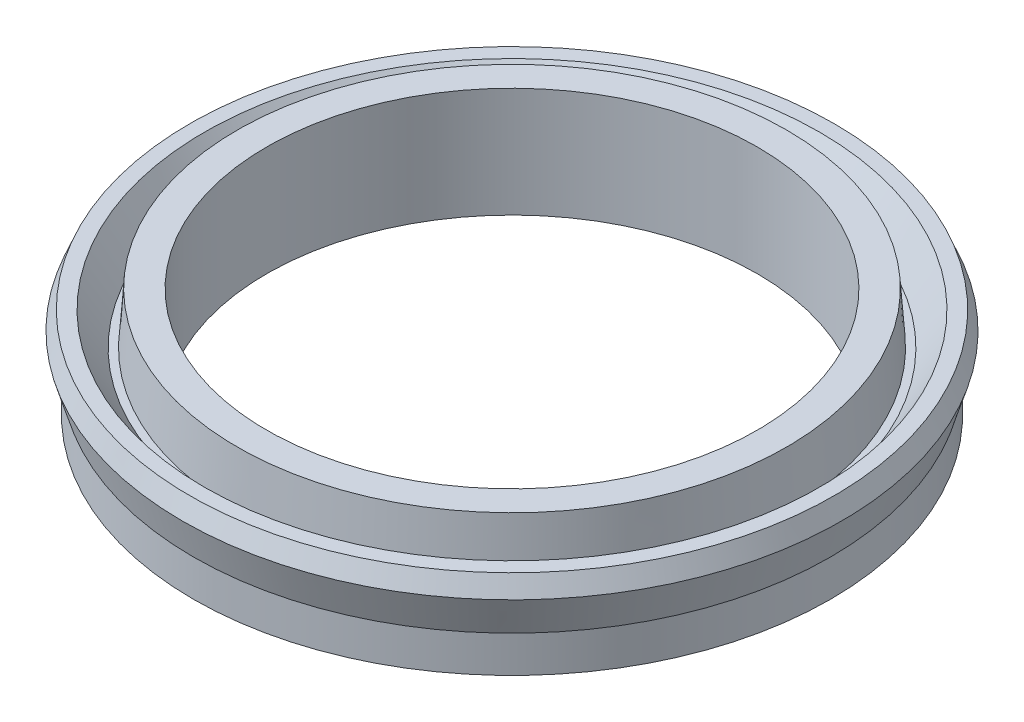
ISO-10303-21;
HEADER;
FILE_DESCRIPTION(('STEP AP214'),'2;1');
FILE_NAME('part.step','',(''),(''),'','','');
FILE_SCHEMA(('AUTOMOTIVE_DESIGN { 1 0 10303 214 1 1 1 1 }'));
ENDSEC;
DATA;
#1=APPLICATION_CONTEXT('core data for automotive mechanical design processes');
#2=APPLICATION_PROTOCOL_DEFINITION('international standard','automotive_design',2000,#1);
#3=PRODUCT_CONTEXT('',#1,'mechanical');
#4=PRODUCT('Part','Part','',(#3));
#5=PRODUCT_RELATED_PRODUCT_CATEGORY('part','',(#4));
#6=PRODUCT_DEFINITION_FORMATION('','',#4);
#7=PRODUCT_DEFINITION_CONTEXT('part definition',#1,'design');
#8=PRODUCT_DEFINITION('design','',#6,#7);
#9=PRODUCT_DEFINITION_SHAPE('','',#8);
#10=(LENGTH_UNIT() NAMED_UNIT(*) SI_UNIT(.MILLI.,.METRE.));
#11=(NAMED_UNIT(*) PLANE_ANGLE_UNIT() SI_UNIT($,.RADIAN.));
#12=(NAMED_UNIT(*) SI_UNIT($,.STERADIAN.) SOLID_ANGLE_UNIT());
#13=UNCERTAINTY_MEASURE_WITH_UNIT(LENGTH_MEASURE(1.E-05),#10,'distance_accuracy_value','');
#14=(GEOMETRIC_REPRESENTATION_CONTEXT(3) GLOBAL_UNCERTAINTY_ASSIGNED_CONTEXT((#13)) GLOBAL_UNIT_ASSIGNED_CONTEXT((#10,
#11,#12)) REPRESENTATION_CONTEXT('',''));
#15=CARTESIAN_POINT('',(0.,0.,0.));
#16=DIRECTION('',(0.,0.,1.));
#17=DIRECTION('',(1.,0.,0.));
#18=AXIS2_PLACEMENT_3D('',#15,#16,#17);
#19=CARTESIAN_POINT('',(8.7,0.,0.));
#20=DIRECTION('',(0.,-1.,0.));
#21=DIRECTION('',(0.,0.,-1.));
#22=AXIS2_PLACEMENT_3D('',#19,#20,#21);
#23=PLANE('',#22);
#24=CARTESIAN_POINT('',(0.,0.,0.));
#25=DIRECTION('',(0.,-1.,0.));
#26=DIRECTION('',(0.,0.,-1.));
#27=AXIS2_PLACEMENT_3D('',#24,#25,#26);
#28=CIRCLE('',#27,8.7);
#29=CARTESIAN_POINT('',(0.,0.,-8.7));
#30=VERTEX_POINT('',#29);
#31=EDGE_CURVE('E49',#30,#30,#28,.T.);
#32=ORIENTED_EDGE('',*,*,#31,.T.);
#33=EDGE_LOOP('',(#32));
#34=FACE_BOUND('',#33,.T.);
#35=CARTESIAN_POINT('',(0.,0.,0.));
#36=DIRECTION('',(0.,-1.,0.));
#37=DIRECTION('',(0.,0.,-1.));
#38=AXIS2_PLACEMENT_3D('',#35,#36,#37);
#39=CIRCLE('',#38,6.7);
#40=CARTESIAN_POINT('',(0.,0.,-6.7));
#41=VERTEX_POINT('',#40);
#42=EDGE_CURVE('E10',#41,#41,#39,.T.);
#43=ORIENTED_EDGE('',*,*,#42,.F.);
#44=EDGE_LOOP('',(#43));
#45=FACE_BOUND('',#44,.T.);
#46=ADVANCED_FACE('F15',(#34,#45),#23,.T.);
#47=CARTESIAN_POINT('',(0.,0.,0.));
#48=DIRECTION('',(0.,-1.,0.));
#49=DIRECTION('',(0.,0.,-1.));
#50=AXIS2_PLACEMENT_3D('',#47,#48,#49);
#51=CYLINDRICAL_SURFACE('',#50,6.7);
#52=ORIENTED_EDGE('',*,*,#42,.T.);
#53=EDGE_LOOP('',(#52));
#54=FACE_BOUND('',#53,.T.);
#55=CARTESIAN_POINT('',(0.,3.,0.));
#56=DIRECTION('',(0.,-1.,0.));
#57=DIRECTION('',(0.,0.,-1.));
#58=AXIS2_PLACEMENT_3D('',#55,#56,#57);
#59=CIRCLE('',#58,6.7);
#60=CARTESIAN_POINT('',(0.,3.,-6.7));
#61=VERTEX_POINT('',#60);
#62=EDGE_CURVE('E21',#61,#61,#59,.T.);
#63=ORIENTED_EDGE('',*,*,#62,.F.);
#64=EDGE_LOOP('',(#63));
#65=FACE_BOUND('',#64,.T.);
#66=ADVANCED_FACE('F69',(#54,#65),#51,.F.);
#67=CARTESIAN_POINT('',(6.7,3.,0.));
#68=DIRECTION('',(0.,1.,0.));
#69=DIRECTION('',(0.,0.,1.));
#70=AXIS2_PLACEMENT_3D('',#67,#68,#69);
#71=PLANE('',#70);
#72=ORIENTED_EDGE('',*,*,#62,.T.);
#73=EDGE_LOOP('',(#72));
#74=FACE_BOUND('',#73,.T.);
#75=CARTESIAN_POINT('',(0.,3.,0.));
#76=DIRECTION('',(0.,-1.,0.));
#77=DIRECTION('',(0.,0.,-1.));
#78=AXIS2_PLACEMENT_3D('',#75,#76,#77);
#79=CIRCLE('',#78,7.5);
#80=CARTESIAN_POINT('',(0.,3.,-7.5));
#81=VERTEX_POINT('',#80);
#82=EDGE_CURVE('E25',#81,#81,#79,.T.);
#83=ORIENTED_EDGE('',*,*,#82,.F.);
#84=EDGE_LOOP('',(#83));
#85=FACE_BOUND('',#84,.T.);
#86=ADVANCED_FACE('F74',(#74,#85),#71,.T.);
#87=CARTESIAN_POINT('',(0.,1.6,0.));
#88=DIRECTION('',(0.,-1.,0.));
#89=DIRECTION('',(0.,0.,-1.));
#90=AXIS2_PLACEMENT_3D('',#87,#88,#89);
#91=CONICAL_SURFACE('',#90,7.6,0.0713074647852905);
#92=ORIENTED_EDGE('',*,*,#82,.T.);
#93=EDGE_LOOP('',(#92));
#94=FACE_BOUND('',#93,.T.);
#95=CARTESIAN_POINT('',(0.,1.6,0.));
#96=DIRECTION('',(0.,-1.,0.));
#97=DIRECTION('',(0.,0.,-1.));
#98=AXIS2_PLACEMENT_3D('',#95,#96,#97);
#99=CIRCLE('',#98,7.6);
#100=CARTESIAN_POINT('',(0.,1.6,-7.6));
#101=VERTEX_POINT('',#100);
#102=EDGE_CURVE('E29',#101,#101,#99,.T.);
#103=ORIENTED_EDGE('',*,*,#102,.F.);
#104=EDGE_LOOP('',(#103));
#105=FACE_BOUND('',#104,.T.);
#106=ADVANCED_FACE('F79',(#94,#105),#91,.T.);
#107=CARTESIAN_POINT('',(7.6,1.6,0.));
#108=DIRECTION('',(0.,1.,0.));
#109=DIRECTION('',(0.,0.,1.));
#110=AXIS2_PLACEMENT_3D('',#107,#108,#109);
#111=PLANE('',#110);
#112=ORIENTED_EDGE('',*,*,#102,.T.);
#113=EDGE_LOOP('',(#112));
#114=FACE_BOUND('',#113,.T.);
#115=CARTESIAN_POINT('',(0.,1.6,0.));
#116=DIRECTION('',(0.,-1.,0.));
#117=DIRECTION('',(0.,0.,-1.));
#118=AXIS2_PLACEMENT_3D('',#115,#116,#117);
#119=CIRCLE('',#118,7.8);
#120=CARTESIAN_POINT('',(0.,1.6,-7.8));
#121=VERTEX_POINT('',#120);
#122=EDGE_CURVE('E34',#121,#121,#119,.T.);
#123=ORIENTED_EDGE('',*,*,#122,.F.);
#124=EDGE_LOOP('',(#123));
#125=FACE_BOUND('',#124,.T.);
#126=ADVANCED_FACE('F85',(#114,#125),#111,.T.);
#127=CARTESIAN_POINT('',(0.,2.5,0.));
#128=DIRECTION('',(0.,1.,0.));
#129=DIRECTION('',(0.,0.,1.));
#130=AXIS2_PLACEMENT_3D('',#127,#128,#129);
#131=CONICAL_SURFACE('',#130,8.4,0.588002603547568);
#132=ORIENTED_EDGE('',*,*,#122,.T.);
#133=EDGE_LOOP('',(#132));
#134=FACE_BOUND('',#133,.T.);
#135=CARTESIAN_POINT('',(0.,2.5,0.));
#136=DIRECTION('',(0.,-1.,0.));
#137=DIRECTION('',(0.,0.,-1.));
#138=AXIS2_PLACEMENT_3D('',#135,#136,#137);
#139=CIRCLE('',#138,8.4);
#140=CARTESIAN_POINT('',(0.,2.5,-8.4));
#141=VERTEX_POINT('',#140);
#142=EDGE_CURVE('E37',#141,#141,#139,.T.);
#143=ORIENTED_EDGE('',*,*,#142,.F.);
#144=EDGE_LOOP('',(#143));
#145=FACE_BOUND('',#144,.T.);
#146=ADVANCED_FACE('F89',(#134,#145),#131,.F.);
#147=CARTESIAN_POINT('',(8.4,2.5,0.));
#148=DIRECTION('',(0.,1.,0.));
#149=DIRECTION('',(0.,0.,1.));
#150=AXIS2_PLACEMENT_3D('',#147,#148,#149);
#151=PLANE('',#150);
#152=ORIENTED_EDGE('',*,*,#142,.T.);
#153=EDGE_LOOP('',(#152));
#154=FACE_BOUND('',#153,.T.);
#155=CARTESIAN_POINT('',(0.,2.5,0.));
#156=DIRECTION('',(0.,-1.,0.));
#157=DIRECTION('',(0.,0.,-1.));
#158=AXIS2_PLACEMENT_3D('',#155,#156,#157);
#159=CIRCLE('',#158,8.8);
#160=CARTESIAN_POINT('',(0.,2.5,-8.8));
#161=VERTEX_POINT('',#160);
#162=EDGE_CURVE('E40',#161,#161,#159,.T.);
#163=ORIENTED_EDGE('',*,*,#162,.F.);
#164=EDGE_LOOP('',(#163));
#165=FACE_BOUND('',#164,.T.);
#166=ADVANCED_FACE('F93',(#154,#165),#151,.T.);
#167=CARTESIAN_POINT('',(0.,2.,0.));
#168=DIRECTION('',(0.,-1.,0.));
#169=DIRECTION('',(0.,0.,-1.));
#170=AXIS2_PLACEMENT_3D('',#167,#168,#169);
#171=CONICAL_SURFACE('',#170,9.,0.380506377112366);
#172=ORIENTED_EDGE('',*,*,#162,.T.);
#173=EDGE_LOOP('',(#172));
#174=FACE_BOUND('',#173,.T.);
#175=CARTESIAN_POINT('',(0.,2.,0.));
#176=DIRECTION('',(0.,-1.,0.));
#177=DIRECTION('',(0.,0.,-1.));
#178=AXIS2_PLACEMENT_3D('',#175,#176,#177);
#179=CIRCLE('',#178,9.);
#180=CARTESIAN_POINT('',(0.,2.,-9.));
#181=VERTEX_POINT('',#180);
#182=EDGE_CURVE('E43',#181,#181,#179,.T.);
#183=ORIENTED_EDGE('',*,*,#182,.F.);
#184=EDGE_LOOP('',(#183));
#185=FACE_BOUND('',#184,.T.);
#186=ADVANCED_FACE('F65',(#174,#185),#171,.T.);
#187=CARTESIAN_POINT('',(0.,1.,0.));
#188=DIRECTION('',(0.,1.,0.));
#189=DIRECTION('',(0.,0.,1.));
#190=AXIS2_PLACEMENT_3D('',#187,#188,#189);
#191=CONICAL_SURFACE('',#190,8.7,0.291456794477867);
#192=ORIENTED_EDGE('',*,*,#182,.T.);
#193=EDGE_LOOP('',(#192));
#194=FACE_BOUND('',#193,.T.);
#195=CARTESIAN_POINT('',(0.,1.,0.));
#196=DIRECTION('',(0.,-1.,0.));
#197=DIRECTION('',(0.,0.,-1.));
#198=AXIS2_PLACEMENT_3D('',#195,#196,#197);
#199=CIRCLE('',#198,8.7);
#200=CARTESIAN_POINT('',(0.,1.,-8.7));
#201=VERTEX_POINT('',#200);
#202=EDGE_CURVE('E46',#201,#201,#199,.T.);
#203=ORIENTED_EDGE('',*,*,#202,.F.);
#204=EDGE_LOOP('',(#203));
#205=FACE_BOUND('',#204,.T.);
#206=ADVANCED_FACE('F57',(#194,#205),#191,.T.);
#207=CARTESIAN_POINT('',(0.,0.,0.));
#208=DIRECTION('',(0.,-1.,0.));
#209=DIRECTION('',(0.,0.,-1.));
#210=AXIS2_PLACEMENT_3D('',#207,#208,#209);
#211=CYLINDRICAL_SURFACE('',#210,8.7);
#212=ORIENTED_EDGE('',*,*,#202,.T.);
#213=EDGE_LOOP('',(#212));
#214=FACE_BOUND('',#213,.T.);
#215=ORIENTED_EDGE('',*,*,#31,.F.);
#216=EDGE_LOOP('',(#215));
#217=FACE_BOUND('',#216,.T.);
#218=ADVANCED_FACE('F55',(#214,#217),#211,.T.);
#219=CLOSED_SHELL('',(#46,#66,#86,#106,#126,#146,#166,#186,#206,#218));
#220=MANIFOLD_SOLID_BREP('B1',#219);
#221=ADVANCED_BREP_SHAPE_REPRESENTATION('',(#18,#220),#14);
#222=SHAPE_DEFINITION_REPRESENTATION(#9,#221);
ENDSEC;
END-ISO-10303-21;
